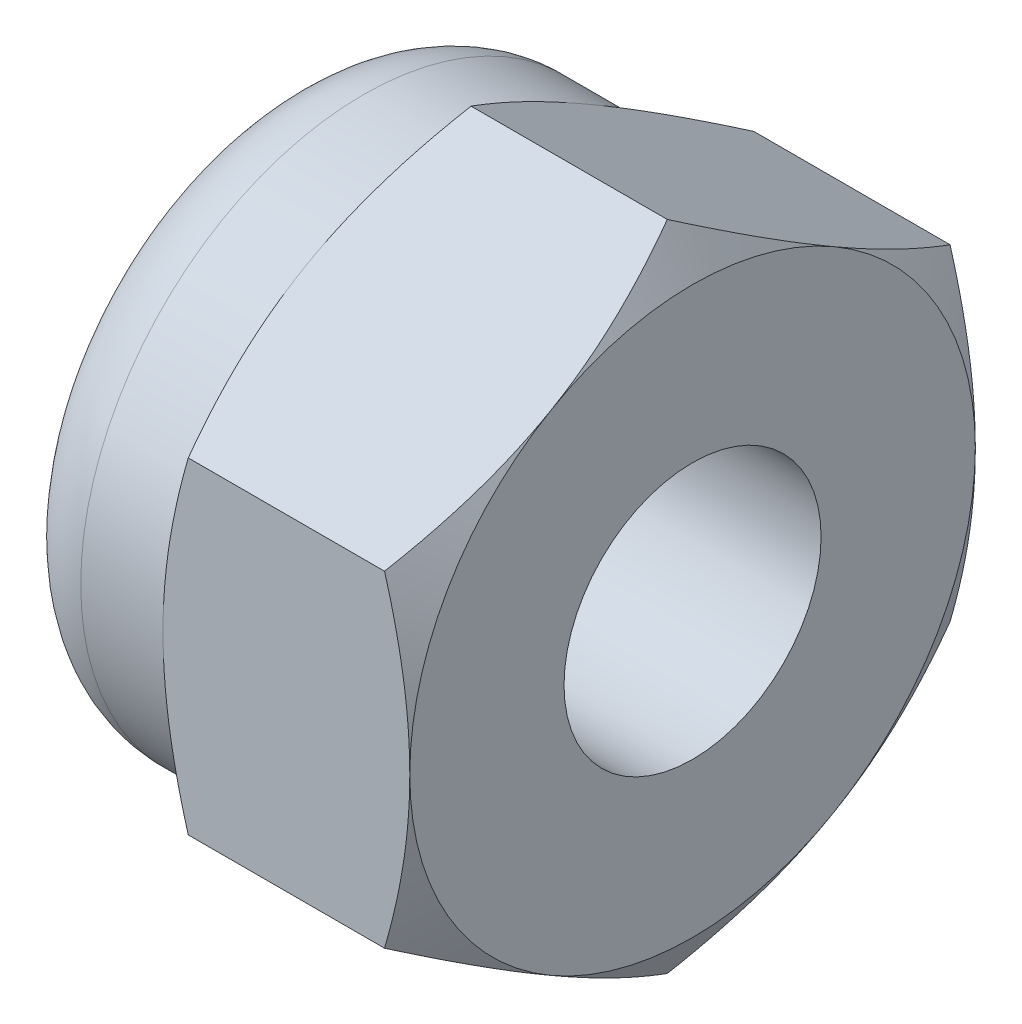
ISO-10303-21;
HEADER;
FILE_DESCRIPTION(('STEP AP214'),'2;1');
FILE_NAME('part.step','',(''),(''),'','','');
FILE_SCHEMA(('AUTOMOTIVE_DESIGN { 1 0 10303 214 1 1 1 1 }'));
ENDSEC;
DATA;
#1=APPLICATION_CONTEXT('core data for automotive mechanical design processes');
#2=APPLICATION_PROTOCOL_DEFINITION('international standard','automotive_design',2000,#1);
#3=PRODUCT_CONTEXT('',#1,'mechanical');
#4=PRODUCT('Part','Part','',(#3));
#5=PRODUCT_RELATED_PRODUCT_CATEGORY('part','',(#4));
#6=PRODUCT_DEFINITION_FORMATION('','',#4);
#7=PRODUCT_DEFINITION_CONTEXT('part definition',#1,'design');
#8=PRODUCT_DEFINITION('design','',#6,#7);
#9=PRODUCT_DEFINITION_SHAPE('','',#8);
#10=(LENGTH_UNIT() NAMED_UNIT(*) SI_UNIT(.MILLI.,.METRE.));
#11=(NAMED_UNIT(*) PLANE_ANGLE_UNIT() SI_UNIT($,.RADIAN.));
#12=(NAMED_UNIT(*) SI_UNIT($,.STERADIAN.) SOLID_ANGLE_UNIT());
#13=UNCERTAINTY_MEASURE_WITH_UNIT(LENGTH_MEASURE(1.E-05),#10,'distance_accuracy_value','');
#14=(GEOMETRIC_REPRESENTATION_CONTEXT(3) GLOBAL_UNCERTAINTY_ASSIGNED_CONTEXT((#13)) GLOBAL_UNIT_ASSIGNED_CONTEXT((#10,
#11,#12)) REPRESENTATION_CONTEXT('',''));
#15=CARTESIAN_POINT('',(0.,0.,0.));
#16=DIRECTION('',(0.,0.,1.));
#17=DIRECTION('',(1.,0.,0.));
#18=AXIS2_PLACEMENT_3D('',#15,#16,#17);
#19=CARTESIAN_POINT('',(-4.,1.58771324027147,-2.75));
#20=DIRECTION('',(0.,0.866025403784439,-0.5));
#21=DIRECTION('',(0.,0.5,0.866025403784439));
#22=AXIS2_PLACEMENT_3D('',#19,#20,#21);
#23=PLANE('',#22);
#24=DIRECTION('',(1.,0.,0.));
#25=VECTOR('',#24,1.);
#26=CARTESIAN_POINT('',(-4.,1.58771324027147,-2.75));
#27=LINE('',#26,#25);
#28=CARTESIAN_POINT('',(-2.15437990693814,1.58771324027148,-2.75));
#29=VERTEX_POINT('',#28);
#30=CARTESIAN_POINT('',(-0.245620093061859,1.58771324027148,-2.75));
#31=VERTEX_POINT('',#30);
#32=EDGE_CURVE('E163',#29,#31,#27,.T.);
#33=ORIENTED_EDGE('',*,*,#32,.F.);
#34=CARTESIAN_POINT('',(-2.15431323663524,1.58759777021764,-2.7502));
#35=CARTESIAN_POINT('',(-2.19461233775074,1.65737010029699,-2.62935077934009));
#36=CARTESIAN_POINT('',(-2.23126309740234,1.72774469983533,-2.50745839737736));
#37=CARTESIAN_POINT('',(-2.2952378170302,1.86971254687003,-2.26156287327211));
#38=CARTESIAN_POINT('',(-2.3225391443255,1.94130831721583,-2.13755536142614));
#39=CARTESIAN_POINT('',(-2.36503825470588,2.08361254889599,-1.89107720202405));
#40=CARTESIAN_POINT('',(-2.38051888137754,2.15429911309864,-1.76864448141258));
#41=CARTESIAN_POINT('',(-2.39900060263006,2.29600490065923,-1.52320285763108));
#42=CARTESIAN_POINT('',(-2.4020170005374,2.36702360884404,-1.40019484676709));
#43=CARTESIAN_POINT('',(-2.39574685457145,2.49972966594897,-1.17034121338921));
#44=CARTESIAN_POINT('',(-2.3879998457233,2.56143686540073,-1.06346120874598));
#45=CARTESIAN_POINT('',(-2.36344481893565,2.68444923614047,-0.85039753266525));
#46=CARTESIAN_POINT('',(-2.34662841034943,2.74575398185008,-0.74421459835111));
#47=CARTESIAN_POINT('',(-2.30458807765405,2.86902004703207,-0.530711510606816));
#48=CARTESIAN_POINT('',(-2.27918591931277,2.93096576264318,-0.423418383857144));
#49=CARTESIAN_POINT('',(-2.22153277416002,3.05393320806134,-0.210432520715948));
#50=CARTESIAN_POINT('',(-2.18929533670102,3.11495651365995,-0.104737054973347));
#51=CARTESIAN_POINT('',(-2.15431323663524,3.17554195059678,0.000200000000000793));
#52=B_SPLINE_CURVE_WITH_KNOTS('',3,(#34,#35,#36,#37,#38,#39,#40,#41,#42,#43,#44,#45,#46,#47,#48,
#49,#50,#51),.UNSPECIFIED.,.F.,.F.,(4,2,2,2,2,2,2,2,4),(0.,0.435912828725887,0.872873557116331,
1.29901931904671,1.72464171213573,2.09526089052937,2.46622354066374,2.84541551798557,
3.22386274754524),.UNSPECIFIED.);
#53=CARTESIAN_POINT('',(-2.4,2.38156986040721,-1.375));
#54=VERTEX_POINT('',#53);
#55=EDGE_CURVE('E283',#29,#54,#52,.T.);
#56=ORIENTED_EDGE('',*,*,#55,.T.);
#57=CARTESIAN_POINT('',(-2.15437990693814,3.17542648054294,0.));
#58=VERTEX_POINT('',#57);
#59=EDGE_CURVE('E277',#54,#58,#52,.T.);
#60=ORIENTED_EDGE('',*,*,#59,.T.);
#61=DIRECTION('',(1.,0.,0.));
#62=VECTOR('',#61,1.);
#63=CARTESIAN_POINT('',(-4.,3.17542648054294,0.));
#64=LINE('',#63,#62);
#65=CARTESIAN_POINT('',(-0.245620093061859,3.17542648054294,0.));
#66=VERTEX_POINT('',#65);
#67=EDGE_CURVE('E170',#58,#66,#64,.T.);
#68=ORIENTED_EDGE('',*,*,#67,.T.);
#69=CARTESIAN_POINT('',(-0.245686763364757,3.17554195059678,0.000200000000000732));
#70=CARTESIAN_POINT('',(-0.20538766224926,3.10576962051743,-0.120649220659905));
#71=CARTESIAN_POINT('',(-0.16873690259766,3.03539502097908,-0.242541602622633));
#72=CARTESIAN_POINT('',(-0.104762182969799,2.89342717394439,-0.488437126727892));
#73=CARTESIAN_POINT('',(-0.0774608556744962,2.82183140359859,-0.612444638573854));
#74=CARTESIAN_POINT('',(-0.0349617452941162,2.67952717191843,-0.858922797975942));
#75=CARTESIAN_POINT('',(-0.0194811186224573,2.60884060771577,-0.981355518587416));
#76=CARTESIAN_POINT('',(-0.000999397369939991,2.46713482015519,-1.22679714236891));
#77=CARTESIAN_POINT('',(0.00201700053740085,2.39611611197038,-1.34980515323291));
#78=CARTESIAN_POINT('',(-0.00425314542854591,2.26341005486544,-1.57965878661079));
#79=CARTESIAN_POINT('',(-0.0120001542767014,2.20170285541369,-1.68653879125402));
#80=CARTESIAN_POINT('',(-0.0365551810643533,2.07869048467395,-1.89960246733475));
#81=CARTESIAN_POINT('',(-0.0533715896505684,2.01738573896434,-2.00578540164889));
#82=CARTESIAN_POINT('',(-0.0954119223459535,1.89411967378235,-2.21928848939318));
#83=CARTESIAN_POINT('',(-0.120814080687228,1.83217395817123,-2.32658161614285));
#84=CARTESIAN_POINT('',(-0.178467225839978,1.70920651275308,-2.53956747928405));
#85=CARTESIAN_POINT('',(-0.210704663298978,1.64818320715446,-2.64526294502665));
#86=CARTESIAN_POINT('',(-0.245686763364755,1.58759777021764,-2.7502));
#87=B_SPLINE_CURVE_WITH_KNOTS('',3,(#69,#70,#71,#72,#73,#74,#75,#76,#77,#78,#79,#80,#81,#82,#83,
#84,#85,#86),.UNSPECIFIED.,.F.,.F.,(4,2,2,2,2,2,2,2,4),(0.,0.435912828725888,0.872873557116331,
1.29901931904671,1.72464171213573,2.09526089052937,2.46622354066374,2.84541551798557,
3.22386274754524),.UNSPECIFIED.);
#88=CARTESIAN_POINT('',(0.,2.38156986040721,-1.375));
#89=VERTEX_POINT('',#88);
#90=EDGE_CURVE('E328',#66,#89,#87,.T.);
#91=ORIENTED_EDGE('',*,*,#90,.T.);
#92=EDGE_CURVE('E231',#89,#31,#87,.T.);
#93=ORIENTED_EDGE('',*,*,#92,.T.);
#94=EDGE_LOOP('',(#33,#56,#60,#68,#91,#93));
#95=FACE_BOUND('',#94,.T.);
#96=ADVANCED_FACE('F35',(#95),#23,.T.);
#97=CARTESIAN_POINT('',(-4.,-1.58771324027147,-2.75));
#98=DIRECTION('',(0.,0.,-1.));
#99=DIRECTION('',(0.,1.,0.));
#100=AXIS2_PLACEMENT_3D('',#97,#98,#99);
#101=PLANE('',#100);
#102=DIRECTION('',(1.,0.,0.));
#103=VECTOR('',#102,1.);
#104=CARTESIAN_POINT('',(-4.,-1.58771324027147,-2.75));
#105=LINE('',#104,#103);
#106=CARTESIAN_POINT('',(-2.15437990693814,-1.58771324027147,-2.75));
#107=VERTEX_POINT('',#106);
#108=CARTESIAN_POINT('',(-0.245620093061859,-1.58771324027147,-2.75));
#109=VERTEX_POINT('',#108);
#110=EDGE_CURVE('E160',#107,#109,#105,.T.);
#111=ORIENTED_EDGE('',*,*,#110,.F.);
#112=CARTESIAN_POINT('',(-1.08405108591023,-4.21085047466774,-2.75));
#113=CARTESIAN_POINT('',(-1.14239960966293,-4.09010989011095,-2.75));
#114=CARTESIAN_POINT('',(-1.20016810098766,-3.96908383499853,-2.75));
#115=CARTESIAN_POINT('',(-1.31421356815426,-3.72630642982622,-2.75));
#116=CARTESIAN_POINT('',(-1.37049028575682,-3.60455495860072,-2.75));
#117=CARTESIAN_POINT('',(-1.48151722378069,-3.35951467553998,-2.75));
#118=CARTESIAN_POINT('',(-1.53625686571547,-3.23622105325521,-2.75));
#119=CARTESIAN_POINT('',(-1.6433849498491,-2.98862044341193,-2.75));
#120=CARTESIAN_POINT('',(-1.69577351460521,-2.86431350907558,-2.75));
#121=CARTESIAN_POINT('',(-1.79819621428788,-2.61294539628322,-2.75));
#122=CARTESIAN_POINT('',(-1.84819354800061,-2.48586914007059,-2.75));
#123=CARTESIAN_POINT('',(-1.94427243496487,-2.23021775204037,-2.75));
#124=CARTESIAN_POINT('',(-1.99035355255758,-2.1016424552668,-2.75));
#125=CARTESIAN_POINT('',(-2.07736182002804,-1.84305250936245,-2.75));
#126=CARTESIAN_POINT('',(-2.11829992722098,-1.71304158512251,-2.75));
#127=CARTESIAN_POINT('',(-2.19369263632952,-1.45117146066374,-2.75));
#128=CARTESIAN_POINT('',(-2.22814928856133,-1.31931285916158,-2.75));
#129=CARTESIAN_POINT('',(-2.28890631402182,-1.05365730058872,-2.75));
#130=CARTESIAN_POINT('',(-2.31520451432339,-0.91985983703522,-2.75));
#131=CARTESIAN_POINT('',(-2.35787397795958,-0.650651771588405,-2.75));
#132=CARTESIAN_POINT('',(-2.374245232524,-0.51524116827003,-2.75));
#133=CARTESIAN_POINT('',(-2.39561251963743,-0.244372959827892,-2.75));
#134=CARTESIAN_POINT('',(-2.40068056630442,-0.108921183336607,-2.75));
#135=CARTESIAN_POINT('',(-2.39917219036022,0.161887520872983,-2.75));
#136=CARTESIAN_POINT('',(-2.39259879041321,0.297244464085856,-2.75));
#137=CARTESIAN_POINT('',(-2.37189580522956,0.52838603312679,-2.75));
#138=CARTESIAN_POINT('',(-2.36046228070885,0.624425663637138,-2.75));
#139=CARTESIAN_POINT('',(-2.33247817430538,0.815763046773999,-2.75));
#140=CARTESIAN_POINT('',(-2.31592678540798,0.911060679966734,-2.75));
#141=CARTESIAN_POINT('',(-2.25946447516098,1.19576289915276,-2.75));
#142=CARTESIAN_POINT('',(-2.21275994778995,1.38383299011474,-2.75));
#143=CARTESIAN_POINT('',(-2.13220726693515,1.66525127863567,-2.75));
#144=CARTESIAN_POINT('',(-2.10319641445221,1.76006636738015,-2.75));
#145=CARTESIAN_POINT('',(-2.04230407192395,1.9487069300056,-2.75));
#146=CARTESIAN_POINT('',(-2.01042456185308,2.04253303727579,-2.75));
#147=CARTESIAN_POINT('',(-1.94445826089924,2.22880328617383,-2.75));
#148=CARTESIAN_POINT('',(-1.91038490408283,2.32125223383933,-2.75));
#149=CARTESIAN_POINT('',(-1.84023827062062,2.50543284907629,-2.75));
#150=CARTESIAN_POINT('',(-1.80416418567468,2.59716420940991,-2.75));
#151=CARTESIAN_POINT('',(-1.76728717077665,2.68856388993766,-2.75));
#152=B_SPLINE_CURVE_WITH_KNOTS('',3,(#112,#113,#114,#115,#116,#117,#118,#119,#120,#121,#122,
#123,#124,#125,#126,#127,#128,#129,#130,#131,#132,#133,#134,#135,#136,#137,#138,#139,#140,#141,
#142,#143,#144,#145,#146,#147,#148,#149,#150,#151),.UNSPECIFIED.,.F.,.F.,(4,2,2,2,2,2,2,2,2,2,2,
2,2,2,2,2,2,2,2,4),(0.,0.402305724628122,0.804680643080822,1.20935819137344,1.61401462001939,
2.02363897413607,2.43330883735974,2.8420905276564,3.25074268740349,3.6595035945605,
4.06826486284692,4.47441433252271,4.88045836225495,5.17047019471949,5.46052778127857,
6.04107464708557,6.33851326493238,6.63574813987144,6.93130997697814,7.22699210430481),.UNSPECIFIED.);
#153=CARTESIAN_POINT('',(-2.4,0.,-2.75));
#154=VERTEX_POINT('',#153);
#155=EDGE_CURVE('E153',#107,#154,#152,.T.);
#156=ORIENTED_EDGE('',*,*,#155,.T.);
#157=EDGE_CURVE('E246',#154,#29,#152,.T.);
#158=ORIENTED_EDGE('',*,*,#157,.T.);
#159=ORIENTED_EDGE('',*,*,#32,.T.);
#160=CARTESIAN_POINT('',(-1.31594891408976,-4.21085047466774,-2.75));
#161=CARTESIAN_POINT('',(-1.25760039033706,-4.09010989011094,-2.75));
#162=CARTESIAN_POINT('',(-1.19983189901234,-3.96908383499853,-2.75));
#163=CARTESIAN_POINT('',(-1.08578643184574,-3.72630642982622,-2.75));
#164=CARTESIAN_POINT('',(-1.02950971424317,-3.60455495860072,-2.75));
#165=CARTESIAN_POINT('',(-0.918482776219309,-3.35951467553998,-2.75));
#166=CARTESIAN_POINT('',(-0.863743134284527,-3.23622105325521,-2.75));
#167=CARTESIAN_POINT('',(-0.756615050150899,-2.98862044341193,-2.75));
#168=CARTESIAN_POINT('',(-0.704226485394788,-2.86431350907558,-2.75));
#169=CARTESIAN_POINT('',(-0.601803785712118,-2.61294539628323,-2.75));
#170=CARTESIAN_POINT('',(-0.551806451999385,-2.48586914007059,-2.75));
#171=CARTESIAN_POINT('',(-0.455727565035127,-2.23021775204037,-2.75));
#172=CARTESIAN_POINT('',(-0.409646447442418,-2.1016424552668,-2.75));
#173=CARTESIAN_POINT('',(-0.322638179971965,-1.84305250936246,-2.75));
#174=CARTESIAN_POINT('',(-0.281700072779021,-1.71304158512251,-2.75));
#175=CARTESIAN_POINT('',(-0.206307363670478,-1.45117146066374,-2.75));
#176=CARTESIAN_POINT('',(-0.171850711438669,-1.31931285916158,-2.75));
#177=CARTESIAN_POINT('',(-0.11109368597818,-1.05365730058872,-2.75));
#178=CARTESIAN_POINT('',(-0.0847954856766139,-0.919859837035221,-2.75));
#179=CARTESIAN_POINT('',(-0.0421260220404217,-0.650651771588406,-2.75));
#180=CARTESIAN_POINT('',(-0.0257547674760019,-0.515241168270031,-2.75));
#181=CARTESIAN_POINT('',(-0.00438748036256584,-0.244372959827892,-2.75));
#182=CARTESIAN_POINT('',(0.000680566304424056,-0.108921183336607,-2.75));
#183=CARTESIAN_POINT('',(-0.000827809639778918,0.161887520872983,-2.75));
#184=CARTESIAN_POINT('',(-0.00740120958678832,0.297244464085855,-2.75));
#185=CARTESIAN_POINT('',(-0.0281041947704376,0.528386033126789,-2.75));
#186=CARTESIAN_POINT('',(-0.0395377192911538,0.624425663637137,-2.75));
#187=CARTESIAN_POINT('',(-0.0675218256946247,0.815763046773998,-2.75));
#188=CARTESIAN_POINT('',(-0.0840732145920173,0.911060679966735,-2.75));
#189=CARTESIAN_POINT('',(-0.140535524839016,1.19576289915276,-2.75));
#190=CARTESIAN_POINT('',(-0.187240052210045,1.38383299011475,-2.75));
#191=CARTESIAN_POINT('',(-0.267792733064847,1.66525127863567,-2.75));
#192=CARTESIAN_POINT('',(-0.29680358554779,1.76006636738016,-2.75));
#193=CARTESIAN_POINT('',(-0.357695928076048,1.94870693000561,-2.75));
#194=CARTESIAN_POINT('',(-0.389575438146922,2.04253303727579,-2.75));
#195=CARTESIAN_POINT('',(-0.455541739100759,2.22880328617383,-2.75));
#196=CARTESIAN_POINT('',(-0.489615095917171,2.32125223383934,-2.75));
#197=CARTESIAN_POINT('',(-0.559761729379377,2.5054328490763,-2.75));
#198=CARTESIAN_POINT('',(-0.595835814325318,2.59716420940992,-2.75));
#199=CARTESIAN_POINT('',(-0.632712829223347,2.68856388993767,-2.75));
#200=B_SPLINE_CURVE_WITH_KNOTS('',3,(#160,#161,#162,#163,#164,#165,#166,#167,#168,#169,#170,
#171,#172,#173,#174,#175,#176,#177,#178,#179,#180,#181,#182,#183,#184,#185,#186,#187,#188,#189,
#190,#191,#192,#193,#194,#195,#196,#197,#198,#199),.UNSPECIFIED.,.F.,.F.,(4,2,2,2,2,2,2,2,2,2,2,
2,2,2,2,2,2,2,2,4),(0.,0.402305724628121,0.80468064308082,1.20935819137344,1.61401462001939,
2.02363897413607,2.43330883735973,2.84209052765639,3.25074268740349,3.65950359456049,
4.06826486284691,4.47441433252271,4.88045836225495,5.17047019471949,5.46052778127857,
6.04107464708557,6.33851326493238,6.63574813987144,6.93130997697814,7.22699210430481),.UNSPECIFIED.);
#201=CARTESIAN_POINT('',(0.,0.,-2.75));
#202=VERTEX_POINT('',#201);
#203=EDGE_CURVE('E229',#31,#202,#200,.F.);
#204=ORIENTED_EDGE('',*,*,#203,.T.);
#205=EDGE_CURVE('E222',#202,#109,#200,.F.);
#206=ORIENTED_EDGE('',*,*,#205,.T.);
#207=EDGE_LOOP('',(#111,#156,#158,#159,#204,#206));
#208=FACE_BOUND('',#207,.T.);
#209=ADVANCED_FACE('F237',(#208),#101,.T.);
#210=CARTESIAN_POINT('',(-4.,-3.17542648054294,0.));
#211=DIRECTION('',(0.,-0.866025403784439,-0.5));
#212=DIRECTION('',(0.,0.5,-0.866025403784439));
#213=AXIS2_PLACEMENT_3D('',#210,#211,#212);
#214=PLANE('',#213);
#215=DIRECTION('',(1.,0.,0.));
#216=VECTOR('',#215,1.);
#217=CARTESIAN_POINT('',(-4.,-3.17542648054294,0.));
#218=LINE('',#217,#216);
#219=CARTESIAN_POINT('',(-2.15437990693814,-3.17542648054294,0.));
#220=VERTEX_POINT('',#219);
#221=CARTESIAN_POINT('',(-0.245620093061859,-3.17542648054294,0.));
#222=VERTEX_POINT('',#221);
#223=EDGE_CURVE('E150',#220,#222,#218,.T.);
#224=ORIENTED_EDGE('',*,*,#223,.F.);
#225=CARTESIAN_POINT('',(-2.15431323663524,-3.17554195059678,0.00020000000000105));
#226=CARTESIAN_POINT('',(-2.19461233775074,-3.10576962051743,-0.120649220659905));
#227=CARTESIAN_POINT('',(-2.23126309740234,-3.03539502097908,-0.242541602622633));
#228=CARTESIAN_POINT('',(-2.2952378170302,-2.89342717394439,-0.488437126727891));
#229=CARTESIAN_POINT('',(-2.3225391443255,-2.82183140359858,-0.612444638573854));
#230=CARTESIAN_POINT('',(-2.36503825470588,-2.67952717191843,-0.858922797975942));
#231=CARTESIAN_POINT('',(-2.38051888137754,-2.60884060771577,-0.981355518587416));
#232=CARTESIAN_POINT('',(-2.39900060263006,-2.46713482015519,-1.22679714236891));
#233=CARTESIAN_POINT('',(-2.4020170005374,-2.39611611197038,-1.34980515323291));
#234=CARTESIAN_POINT('',(-2.39574685457145,-2.26341005486544,-1.57965878661079));
#235=CARTESIAN_POINT('',(-2.3879998457233,-2.20170285541369,-1.68653879125402));
#236=CARTESIAN_POINT('',(-2.36344481893565,-2.07869048467395,-1.89960246733475));
#237=CARTESIAN_POINT('',(-2.34662841034943,-2.01738573896434,-2.00578540164889));
#238=CARTESIAN_POINT('',(-2.30458807765405,-1.89411967378235,-2.21928848939318));
#239=CARTESIAN_POINT('',(-2.27918591931277,-1.83217395817123,-2.32658161614285));
#240=CARTESIAN_POINT('',(-2.22153277416002,-1.70920651275308,-2.53956747928405));
#241=CARTESIAN_POINT('',(-2.18929533670102,-1.64818320715446,-2.64526294502665));
#242=CARTESIAN_POINT('',(-2.15431323663524,-1.58759777021764,-2.7502));
#243=B_SPLINE_CURVE_WITH_KNOTS('',3,(#225,#226,#227,#228,#229,#230,#231,#232,#233,#234,#235,
#236,#237,#238,#239,#240,#241,#242),.UNSPECIFIED.,.F.,.F.,(4,2,2,2,2,2,2,2,4),(0.,
0.435912828725888,0.872873557116331,1.29901931904671,1.72464171213573,2.09526089052937,
2.46622354066374,2.84541551798557,3.22386274754524),.UNSPECIFIED.);
#244=CARTESIAN_POINT('',(-2.4,-2.38156986040721,-1.375));
#245=VERTEX_POINT('',#244);
#246=EDGE_CURVE('E132',#220,#245,#243,.T.);
#247=ORIENTED_EDGE('',*,*,#246,.T.);
#248=EDGE_CURVE('E143',#245,#107,#243,.T.);
#249=ORIENTED_EDGE('',*,*,#248,.T.);
#250=ORIENTED_EDGE('',*,*,#110,.T.);
#251=CARTESIAN_POINT('',(-0.245686763364755,-1.58759777021764,-2.7502));
#252=CARTESIAN_POINT('',(-0.205387662249259,-1.65737010029699,-2.62935077934009));
#253=CARTESIAN_POINT('',(-0.168736902597658,-1.72774469983533,-2.50745839737736));
#254=CARTESIAN_POINT('',(-0.104762182969798,-1.86971254687003,-2.26156287327211));
#255=CARTESIAN_POINT('',(-0.0774608556744953,-1.94130831721583,-2.13755536142614));
#256=CARTESIAN_POINT('',(-0.0349617452941155,-2.08361254889599,-1.89107720202405));
#257=CARTESIAN_POINT('',(-0.0194811186224567,-2.15429911309864,-1.76864448141258));
#258=CARTESIAN_POINT('',(-0.000999397369939655,-2.29600490065923,-1.52320285763108));
#259=CARTESIAN_POINT('',(0.00201700053740091,-2.36702360884404,-1.40019484676709));
#260=CARTESIAN_POINT('',(-0.00425314542854593,-2.49972966594897,-1.17034121338921));
#261=CARTESIAN_POINT('',(-0.0120001542767013,-2.56143686540073,-1.06346120874598));
#262=CARTESIAN_POINT('',(-0.0365551810643533,-2.68444923614047,-0.85039753266525));
#263=CARTESIAN_POINT('',(-0.0533715896505686,-2.74575398185008,-0.74421459835111));
#264=CARTESIAN_POINT('',(-0.0954119223459542,-2.86902004703206,-0.530711510606815));
#265=CARTESIAN_POINT('',(-0.120814080687228,-2.93096576264318,-0.423418383857144));
#266=CARTESIAN_POINT('',(-0.178467225839979,-3.05393320806134,-0.210432520715948));
#267=CARTESIAN_POINT('',(-0.210704663298979,-3.11495651365995,-0.104737054973346));
#268=CARTESIAN_POINT('',(-0.245686763364756,-3.17554195059678,0.000200000000000986));
#269=B_SPLINE_CURVE_WITH_KNOTS('',3,(#251,#252,#253,#254,#255,#256,#257,#258,#259,#260,#261,
#262,#263,#264,#265,#266,#267,#268),.UNSPECIFIED.,.F.,.F.,(4,2,2,2,2,2,2,2,4),(0.,
0.435912828725888,0.872873557116331,1.29901931904671,1.72464171213573,2.09526089052937,
2.46622354066374,2.84541551798557,3.22386274754524),.UNSPECIFIED.);
#270=CARTESIAN_POINT('',(0.,-2.38156986040721,-1.375));
#271=VERTEX_POINT('',#270);
#272=EDGE_CURVE('E230',#109,#271,#269,.T.);
#273=ORIENTED_EDGE('',*,*,#272,.T.);
#274=EDGE_CURVE('E159',#271,#222,#269,.T.);
#275=ORIENTED_EDGE('',*,*,#274,.T.);
#276=EDGE_LOOP('',(#224,#247,#249,#250,#273,#275));
#277=FACE_BOUND('',#276,.T.);
#278=ADVANCED_FACE('F156',(#277),#214,.T.);
#279=CARTESIAN_POINT('',(-4.,-1.58771324027147,2.75));
#280=DIRECTION('',(0.,-0.866025403784439,0.5));
#281=DIRECTION('',(0.,-0.5,-0.866025403784439));
#282=AXIS2_PLACEMENT_3D('',#279,#280,#281);
#283=PLANE('',#282);
#284=DIRECTION('',(1.,0.,0.));
#285=VECTOR('',#284,1.);
#286=CARTESIAN_POINT('',(-4.,-1.58771324027147,2.75));
#287=LINE('',#286,#285);
#288=CARTESIAN_POINT('',(-2.15437990693814,-1.58771324027147,2.75));
#289=VERTEX_POINT('',#288);
#290=CARTESIAN_POINT('',(-0.245620093061859,-1.58771324027147,2.75));
#291=VERTEX_POINT('',#290);
#292=EDGE_CURVE('E161',#289,#291,#287,.T.);
#293=ORIENTED_EDGE('',*,*,#292,.F.);
#294=CARTESIAN_POINT('',(-2.15431323663524,-1.58759777021763,2.7502));
#295=CARTESIAN_POINT('',(-2.19461233775074,-1.65737010029699,2.6293507793401));
#296=CARTESIAN_POINT('',(-2.23126309740234,-1.72774469983533,2.50745839737737));
#297=CARTESIAN_POINT('',(-2.2952378170302,-1.86971254687003,2.26156287327211));
#298=CARTESIAN_POINT('',(-2.3225391443255,-1.94130831721583,2.13755536142615));
#299=CARTESIAN_POINT('',(-2.36503825470588,-2.08361254889599,1.89107720202406));
#300=CARTESIAN_POINT('',(-2.38051888137754,-2.15429911309864,1.76864448141258));
#301=CARTESIAN_POINT('',(-2.39900060263006,-2.29600490065923,1.52320285763109));
#302=CARTESIAN_POINT('',(-2.4020170005374,-2.36702360884404,1.40019484676709));
#303=CARTESIAN_POINT('',(-2.39574685457145,-2.49972966594897,1.17034121338921));
#304=CARTESIAN_POINT('',(-2.3879998457233,-2.56143686540073,1.06346120874598));
#305=CARTESIAN_POINT('',(-2.36344481893565,-2.68444923614047,0.850397532665252));
#306=CARTESIAN_POINT('',(-2.34662841034943,-2.74575398185008,0.744214598351112));
#307=CARTESIAN_POINT('',(-2.30458807765405,-2.86902004703206,0.530711510606818));
#308=CARTESIAN_POINT('',(-2.27918591931277,-2.93096576264318,0.423418383857146));
#309=CARTESIAN_POINT('',(-2.22153277416002,-3.05393320806134,0.21043252071595));
#310=CARTESIAN_POINT('',(-2.18929533670102,-3.11495651365995,0.104737054973348));
#311=CARTESIAN_POINT('',(-2.15431323663524,-3.17554195059678,-0.000199999999999301));
#312=B_SPLINE_CURVE_WITH_KNOTS('',3,(#294,#295,#296,#297,#298,#299,#300,#301,#302,#303,#304,
#305,#306,#307,#308,#309,#310,#311),.UNSPECIFIED.,.F.,.F.,(4,2,2,2,2,2,2,2,4),(0.,
0.435912828725888,0.872873557116331,1.29901931904671,1.72464171213573,2.09526089052937,
2.46622354066374,2.84541551798557,3.22386274754524),.UNSPECIFIED.);
#313=CARTESIAN_POINT('',(-2.4,-2.38156986040721,1.375));
#314=VERTEX_POINT('',#313);
#315=EDGE_CURVE('E152',#289,#314,#312,.T.);
#316=ORIENTED_EDGE('',*,*,#315,.T.);
#317=EDGE_CURVE('E135',#314,#220,#312,.T.);
#318=ORIENTED_EDGE('',*,*,#317,.T.);
#319=ORIENTED_EDGE('',*,*,#223,.T.);
#320=CARTESIAN_POINT('',(-0.245686763364756,-3.17554195059678,-0.000199999999998929));
#321=CARTESIAN_POINT('',(-0.205387662249259,-3.10576962051743,0.120649220659907));
#322=CARTESIAN_POINT('',(-0.168736902597659,-3.03539502097908,0.242541602622635));
#323=CARTESIAN_POINT('',(-0.104762182969798,-2.89342717394439,0.488437126727893));
#324=CARTESIAN_POINT('',(-0.0774608556744954,-2.82183140359858,0.612444638573856));
#325=CARTESIAN_POINT('',(-0.0349617452941156,-2.67952717191843,0.858922797975944));
#326=CARTESIAN_POINT('',(-0.0194811186224569,-2.60884060771577,0.981355518587417));
#327=CARTESIAN_POINT('',(-0.000999397369939867,-2.46713482015519,1.22679714236892));
#328=CARTESIAN_POINT('',(0.0020170005374009,-2.39611611197038,1.34980515323291));
#329=CARTESIAN_POINT('',(-0.00425314542854602,-2.26341005486544,1.57965878661079));
#330=CARTESIAN_POINT('',(-0.0120001542767017,-2.20170285541369,1.68653879125402));
#331=CARTESIAN_POINT('',(-0.0365551810643537,-2.07869048467395,1.89960246733475));
#332=CARTESIAN_POINT('',(-0.0533715896505689,-2.01738573896433,2.00578540164889));
#333=CARTESIAN_POINT('',(-0.0954119223459542,-1.89411967378235,2.21928848939318));
#334=CARTESIAN_POINT('',(-0.120814080687228,-1.83217395817123,2.32658161614286));
#335=CARTESIAN_POINT('',(-0.178467225839979,-1.70920651275308,2.53956747928405));
#336=CARTESIAN_POINT('',(-0.210704663298979,-1.64818320715446,2.64526294502665));
#337=CARTESIAN_POINT('',(-0.245686763364757,-1.58759777021763,2.7502));
#338=B_SPLINE_CURVE_WITH_KNOTS('',3,(#320,#321,#322,#323,#324,#325,#326,#327,#328,#329,#330,
#331,#332,#333,#334,#335,#336,#337),.UNSPECIFIED.,.F.,.F.,(4,2,2,2,2,2,2,2,4),(0.,
0.435912828725888,0.87287355711633,1.29901931904671,1.72464171213573,2.09526089052937,
2.46622354066374,2.84541551798557,3.22386274754524),.UNSPECIFIED.);
#339=CARTESIAN_POINT('',(0.,-2.38156986040721,1.375));
#340=VERTEX_POINT('',#339);
#341=EDGE_CURVE('E301',#222,#340,#338,.T.);
#342=ORIENTED_EDGE('',*,*,#341,.T.);
#343=EDGE_CURVE('E209',#340,#291,#338,.T.);
#344=ORIENTED_EDGE('',*,*,#343,.T.);
#345=EDGE_LOOP('',(#293,#316,#318,#319,#342,#344));
#346=FACE_BOUND('',#345,.T.);
#347=ADVANCED_FACE('F148',(#346),#283,.T.);
#348=CARTESIAN_POINT('',(-4.,1.58771324027147,2.75));
#349=DIRECTION('',(0.,0.,1.));
#350=DIRECTION('',(1.,0.,0.));
#351=AXIS2_PLACEMENT_3D('',#348,#349,#350);
#352=PLANE('',#351);
#353=DIRECTION('',(1.,0.,0.));
#354=VECTOR('',#353,1.);
#355=CARTESIAN_POINT('',(-4.,1.58771324027147,2.75));
#356=LINE('',#355,#354);
#357=CARTESIAN_POINT('',(-2.15437990693814,1.58771324027147,2.75));
#358=VERTEX_POINT('',#357);
#359=CARTESIAN_POINT('',(-0.245620093061859,1.58771324027147,2.75));
#360=VERTEX_POINT('',#359);
#361=EDGE_CURVE('E165',#358,#360,#356,.T.);
#362=ORIENTED_EDGE('',*,*,#361,.F.);
#363=CARTESIAN_POINT('',(-1.08405156039708,-4.21084949309676,2.75));
#364=CARTESIAN_POINT('',(-1.14240006384778,-4.0901089421409,2.75));
#365=CARTESIAN_POINT('',(-1.20016853488243,-3.96908292065509,2.75));
#366=CARTESIAN_POINT('',(-1.31421396157697,-3.72630558284843,2.75));
#367=CARTESIAN_POINT('',(-1.37049065899754,-3.604554145362,2.75));
#368=CARTESIAN_POINT('',(-1.48151755664726,-3.35951393034354,2.75));
#369=CARTESIAN_POINT('',(-1.53625717839418,-3.23622034236436,2.75));
#370=CARTESIAN_POINT('',(-1.64338522252356,-2.98861980138743,2.75));
#371=CARTESIAN_POINT('',(-1.69577376746325,-2.86431290161182,2.75));
#372=CARTESIAN_POINT('',(-1.79819642785389,-2.61294485887172,2.75));
#373=CARTESIAN_POINT('',(-1.84819374210162,-2.48586863815654,2.75));
#374=CARTESIAN_POINT('',(-1.94427259121541,-2.23021732171541,2.75));
#375=CARTESIAN_POINT('',(-1.99035369042304,-2.10164206103363,2.75));
#376=CARTESIAN_POINT('',(-2.07736192295377,-1.84305218799467,2.75));
#377=CARTESIAN_POINT('',(-2.11830001358612,-1.71304130052583,2.75));
#378=CARTESIAN_POINT('',(-2.19369269237566,-1.45117125062147,2.75));
#379=CARTESIAN_POINT('',(-2.22814933084724,-1.31931268690202,2.75));
#380=CARTESIAN_POINT('',(-2.2889063284691,-1.05365722480012,2.75));
#381=CARTESIAN_POINT('',(-2.31520451590488,-0.91985982021759,2.75));
#382=CARTESIAN_POINT('',(-2.35787396280339,-0.65065187403738,2.75));
#383=CARTESIAN_POINT('',(-2.37424521348946,-0.515241331013594,2.75));
#384=CARTESIAN_POINT('',(-2.39561250345976,-0.24437324286921,2.75));
#385=CARTESIAN_POINT('',(-2.40068055677322,-0.108921526377133,2.75));
#386=CARTESIAN_POINT('',(-2.39917220436733,0.161887058855134,2.75));
#387=CARTESIAN_POINT('',(-2.39259882131445,0.29724394308964,2.75));
#388=CARTESIAN_POINT('',(-2.37189586995316,0.528385436717544,2.75));
#389=CARTESIAN_POINT('',(-2.36046235896981,0.624425050137504,2.75));
#390=CARTESIAN_POINT('',(-2.33247828038665,0.81576239981155,2.75));
#391=CARTESIAN_POINT('',(-2.31592690577232,0.911060016631974,2.75));
#392=CARTESIAN_POINT('',(-2.25946463872172,1.19576218748918,2.75));
#393=CARTESIAN_POINT('',(-2.2127601405827,1.38383224738498,2.75));
#394=CARTESIAN_POINT('',(-2.13220750296942,1.66525048947487,2.75));
#395=CARTESIAN_POINT('',(-2.1031966650045,1.7600655624856,2.75));
#396=CARTESIAN_POINT('',(-2.04230435109341,1.94870609382218,2.75));
#397=CARTESIAN_POINT('',(-2.01042485512149,2.04253218553699,2.75));
#398=CARTESIAN_POINT('',(-1.94445858181355,2.22880240354988,2.75));
#399=CARTESIAN_POINT('',(-1.91038523854446,2.32125133588455,2.75));
#400=CARTESIAN_POINT('',(-1.84023863176889,2.50543192042632,2.75));
#401=CARTESIAN_POINT('',(-1.80416455996268,2.59716326539583,2.75));
#402=CARTESIAN_POINT('',(-1.76728755800251,2.6885629305335,2.75));
#403=B_SPLINE_CURVE_WITH_KNOTS('',3,(#363,#364,#365,#366,#367,#368,#369,#370,#371,#372,#373,
#374,#375,#376,#377,#378,#379,#380,#381,#382,#383,#384,#385,#386,#387,#388,#389,#390,#391,#392,
#393,#394,#395,#396,#397,#398,#399,#400,#401,#402),.UNSPECIFIED.,.F.,.F.,(4,2,2,2,2,2,2,2,2,2,2,
2,2,2,2,2,2,2,2,4),(0.,0.402305607365936,0.804680408536995,1.20935783819118,1.61401414820818,
2.02363838185769,2.43330812457348,2.842089694796,3.25074173456636,3.65950246109143,
4.06826354901183,4.47441284024649,4.88045669141171,5.17046846817546,5.46052599902452,
6.04107275309884,6.33851131304663,6.63574613017457,6.93130791005795,7.22698998004826),.UNSPECIFIED.);
#404=CARTESIAN_POINT('',(-2.4,0.,2.75));
#405=VERTEX_POINT('',#404);
#406=EDGE_CURVE('E55',#358,#405,#403,.F.);
#407=ORIENTED_EDGE('',*,*,#406,.T.);
#408=EDGE_CURVE('E287',#405,#289,#403,.F.);
#409=ORIENTED_EDGE('',*,*,#408,.T.);
#410=ORIENTED_EDGE('',*,*,#292,.T.);
#411=CARTESIAN_POINT('',(-1.31594843960292,-4.21084949309676,2.75));
#412=CARTESIAN_POINT('',(-1.25759993615222,-4.0901089421409,2.75));
#413=CARTESIAN_POINT('',(-1.19983146511756,-3.96908292065509,2.75));
#414=CARTESIAN_POINT('',(-1.08578603842303,-3.72630558284843,2.75));
#415=CARTESIAN_POINT('',(-1.02950934100245,-3.604554145362,2.75));
#416=CARTESIAN_POINT('',(-0.91848244335274,-3.35951393034354,2.75));
#417=CARTESIAN_POINT('',(-0.863742821605821,-3.23622034236436,2.75));
#418=CARTESIAN_POINT('',(-0.756614777476439,-2.98861980138743,2.75));
#419=CARTESIAN_POINT('',(-0.704226232536749,-2.86431290161181,2.75));
#420=CARTESIAN_POINT('',(-0.601803572146111,-2.61294485887171,2.75));
#421=CARTESIAN_POINT('',(-0.551806257898382,-2.48586863815654,2.75));
#422=CARTESIAN_POINT('',(-0.455727408784591,-2.2302173217154,2.75));
#423=CARTESIAN_POINT('',(-0.409646309576962,-2.10164206103363,2.75));
#424=CARTESIAN_POINT('',(-0.322638077046224,-1.84305218799467,2.75));
#425=CARTESIAN_POINT('',(-0.281699986413882,-1.71304130052583,2.75));
#426=CARTESIAN_POINT('',(-0.206307307624343,-1.45117125062147,2.75));
#427=CARTESIAN_POINT('',(-0.171850669152763,-1.31931268690202,2.75));
#428=CARTESIAN_POINT('',(-0.111093671530901,-1.05365722480012,2.75));
#429=CARTESIAN_POINT('',(-0.0847954840951194,-0.919859820217589,2.75));
#430=CARTESIAN_POINT('',(-0.0421260371966101,-0.650651874037379,2.75));
#431=CARTESIAN_POINT('',(-0.0257547865105422,-0.515241331013593,2.75));
#432=CARTESIAN_POINT('',(-0.00438749654023714,-0.24437324286921,2.75));
#433=CARTESIAN_POINT('',(0.000680556773216019,-0.108921526377133,2.75));
#434=CARTESIAN_POINT('',(-0.000827795632672008,0.161887058855134,2.75));
#435=CARTESIAN_POINT('',(-0.00740117868555357,0.29724394308964,2.75));
#436=CARTESIAN_POINT('',(-0.0281041300468433,0.528385436717543,2.75));
#437=CARTESIAN_POINT('',(-0.0395376410301877,0.624425050137504,2.75));
#438=CARTESIAN_POINT('',(-0.0675217196133507,0.815762399811551,2.75));
#439=CARTESIAN_POINT('',(-0.0840730942276823,0.911060016631976,2.75));
#440=CARTESIAN_POINT('',(-0.140535361278285,1.19576218748918,2.75));
#441=CARTESIAN_POINT('',(-0.187239859417296,1.38383224738499,2.75));
#442=CARTESIAN_POINT('',(-0.267792497030582,1.66525048947488,2.75));
#443=CARTESIAN_POINT('',(-0.296803334995505,1.76006556248561,2.75));
#444=CARTESIAN_POINT('',(-0.357695648906593,1.94870609382219,2.75));
#445=CARTESIAN_POINT('',(-0.389575144878509,2.04253218553699,2.75));
#446=CARTESIAN_POINT('',(-0.455541418186455,2.22880240354989,2.75));
#447=CARTESIAN_POINT('',(-0.489614761455539,2.32125133588456,2.75));
#448=CARTESIAN_POINT('',(-0.559761368231117,2.50543192042633,2.75));
#449=CARTESIAN_POINT('',(-0.595835440037326,2.59716326539584,2.75));
#450=CARTESIAN_POINT('',(-0.632712441997493,2.68856293053351,2.75));
#451=B_SPLINE_CURVE_WITH_KNOTS('',3,(#411,#412,#413,#414,#415,#416,#417,#418,#419,#420,#421,
#422,#423,#424,#425,#426,#427,#428,#429,#430,#431,#432,#433,#434,#435,#436,#437,#438,#439,#440,
#441,#442,#443,#444,#445,#446,#447,#448,#449,#450),.UNSPECIFIED.,.F.,.F.,(4,2,2,2,2,2,2,2,2,2,2,
2,2,2,2,2,2,2,2,4),(0.,0.402305607365936,0.804680408536996,1.20935783819118,1.61401414820818,
2.0236383818577,2.43330812457348,2.842089694796,3.25074173456636,3.65950246109143,
4.06826354901183,4.47441284024649,4.88045669141171,5.17046846817545,5.46052599902452,
6.04107275309885,6.33851131304664,6.63574613017458,6.93130791005796,7.22698998004827),.UNSPECIFIED.);
#452=CARTESIAN_POINT('',(0.,0.,2.75));
#453=VERTEX_POINT('',#452);
#454=EDGE_CURVE('E304',#291,#453,#451,.T.);
#455=ORIENTED_EDGE('',*,*,#454,.T.);
#456=EDGE_CURVE('E201',#453,#360,#451,.T.);
#457=ORIENTED_EDGE('',*,*,#456,.T.);
#458=EDGE_LOOP('',(#362,#407,#409,#410,#455,#457));
#459=FACE_BOUND('',#458,.T.);
#460=ADVANCED_FACE('F294',(#459),#352,.T.);
#461=CARTESIAN_POINT('',(-4.,3.17542648054294,0.));
#462=DIRECTION('',(0.,0.866025403784439,0.5));
#463=DIRECTION('',(0.,-0.5,0.866025403784439));
#464=AXIS2_PLACEMENT_3D('',#461,#462,#463);
#465=PLANE('',#464);
#466=ORIENTED_EDGE('',*,*,#67,.F.);
#467=CARTESIAN_POINT('',(-2.15431323663524,3.17554195059678,-0.000199999999999192));
#468=CARTESIAN_POINT('',(-2.19461233775074,3.10576962051743,0.120649220659907));
#469=CARTESIAN_POINT('',(-2.23126309740234,3.03539502097908,0.242541602622635));
#470=CARTESIAN_POINT('',(-2.2952378170302,2.89342717394439,0.488437126727893));
#471=CARTESIAN_POINT('',(-2.3225391443255,2.82183140359858,0.612444638573856));
#472=CARTESIAN_POINT('',(-2.36503825470588,2.67952717191843,0.858922797975944));
#473=CARTESIAN_POINT('',(-2.38051888137754,2.60884060771577,0.981355518587418));
#474=CARTESIAN_POINT('',(-2.39900060263006,2.46713482015519,1.22679714236892));
#475=CARTESIAN_POINT('',(-2.4020170005374,2.39611611197038,1.34980515323291));
#476=CARTESIAN_POINT('',(-2.39574685457145,2.26341005486544,1.57965878661079));
#477=CARTESIAN_POINT('',(-2.3879998457233,2.20170285541369,1.68653879125402));
#478=CARTESIAN_POINT('',(-2.36344481893565,2.07869048467395,1.89960246733475));
#479=CARTESIAN_POINT('',(-2.34662841034943,2.01738573896434,2.00578540164889));
#480=CARTESIAN_POINT('',(-2.30458807765405,1.89411967378235,2.21928848939318));
#481=CARTESIAN_POINT('',(-2.27918591931277,1.83217395817123,2.32658161614286));
#482=CARTESIAN_POINT('',(-2.22153277416002,1.70920651275308,2.53956747928405));
#483=CARTESIAN_POINT('',(-2.18929533670102,1.64818320715446,2.64526294502665));
#484=CARTESIAN_POINT('',(-2.15431323663524,1.58759777021763,2.7502));
#485=B_SPLINE_CURVE_WITH_KNOTS('',3,(#467,#468,#469,#470,#471,#472,#473,#474,#475,#476,#477,
#478,#479,#480,#481,#482,#483,#484),.UNSPECIFIED.,.F.,.F.,(4,2,2,2,2,2,2,2,4),(0.,
0.435912828725888,0.872873557116331,1.29901931904671,1.72464171213573,2.09526089052937,
2.46622354066374,2.84541551798557,3.22386274754524),.UNSPECIFIED.);
#486=CARTESIAN_POINT('',(-2.4,2.38156986040721,1.375));
#487=VERTEX_POINT('',#486);
#488=EDGE_CURVE('E11',#58,#487,#485,.T.);
#489=ORIENTED_EDGE('',*,*,#488,.T.);
#490=EDGE_CURVE('E39',#487,#358,#485,.T.);
#491=ORIENTED_EDGE('',*,*,#490,.T.);
#492=ORIENTED_EDGE('',*,*,#361,.T.);
#493=CARTESIAN_POINT('',(-0.245686763364757,1.58759777021763,2.7502));
#494=CARTESIAN_POINT('',(-0.20538766224926,1.65737010029699,2.6293507793401));
#495=CARTESIAN_POINT('',(-0.16873690259766,1.72774469983533,2.50745839737737));
#496=CARTESIAN_POINT('',(-0.104762182969799,1.86971254687003,2.26156287327211));
#497=CARTESIAN_POINT('',(-0.0774608556744964,1.94130831721583,2.13755536142615));
#498=CARTESIAN_POINT('',(-0.0349617452941165,2.08361254889599,1.89107720202406));
#499=CARTESIAN_POINT('',(-0.0194811186224576,2.15429911309864,1.76864448141258));
#500=CARTESIAN_POINT('',(-0.000999397369940389,2.29600490065923,1.52320285763109));
#501=CARTESIAN_POINT('',(0.00201700053740044,2.36702360884404,1.40019484676709));
#502=CARTESIAN_POINT('',(-0.00425314542854649,2.49972966594897,1.17034121338921));
#503=CARTESIAN_POINT('',(-0.0120001542767022,2.56143686540073,1.06346120874598));
#504=CARTESIAN_POINT('',(-0.0365551810643541,2.68444923614047,0.850397532665253));
#505=CARTESIAN_POINT('',(-0.0533715896505692,2.74575398185008,0.744214598351113));
#506=CARTESIAN_POINT('',(-0.0954119223459545,2.86902004703206,0.530711510606818));
#507=CARTESIAN_POINT('',(-0.120814080687229,2.93096576264318,0.423418383857147));
#508=CARTESIAN_POINT('',(-0.178467225839979,3.05393320806134,0.21043252071595));
#509=CARTESIAN_POINT('',(-0.210704663298979,3.11495651365995,0.104737054973349));
#510=CARTESIAN_POINT('',(-0.245686763364757,3.17554195059678,-0.00019999999999899));
#511=B_SPLINE_CURVE_WITH_KNOTS('',3,(#493,#494,#495,#496,#497,#498,#499,#500,#501,#502,#503,
#504,#505,#506,#507,#508,#509,#510),.UNSPECIFIED.,.F.,.F.,(4,2,2,2,2,2,2,2,4),(0.,
0.435912828725888,0.872873557116332,1.29901931904671,1.72464171213573,2.09526089052937,
2.46622354066374,2.84541551798557,3.22386274754524),.UNSPECIFIED.);
#512=CARTESIAN_POINT('',(0.,2.38156986040721,1.375));
#513=VERTEX_POINT('',#512);
#514=EDGE_CURVE('E179',#360,#513,#511,.T.);
#515=ORIENTED_EDGE('',*,*,#514,.T.);
#516=EDGE_CURVE('E172',#513,#66,#511,.T.);
#517=ORIENTED_EDGE('',*,*,#516,.T.);
#518=EDGE_LOOP('',(#466,#489,#491,#492,#515,#517));
#519=FACE_BOUND('',#518,.T.);
#520=ADVANCED_FACE('F180',(#519),#465,.T.);
#521=CARTESIAN_POINT('',(0.,0.,0.));
#522=DIRECTION('',(1.,0.,0.));
#523=DIRECTION('',(0.,0.,-1.));
#524=AXIS2_PLACEMENT_3D('',#521,#522,#523);
#525=PLANE('',#524);
#526=CARTESIAN_POINT('',(0.,0.,0.));
#527=DIRECTION('',(-1.,0.,0.));
#528=DIRECTION('',(0.,-1.,0.));
#529=AXIS2_PLACEMENT_3D('',#526,#527,#528);
#530=CIRCLE('',#529,1.25);
#531=CARTESIAN_POINT('',(0.,-1.25,0.));
#532=VERTEX_POINT('',#531);
#533=EDGE_CURVE('E362',#532,#532,#530,.T.);
#534=ORIENTED_EDGE('',*,*,#533,.T.);
#535=EDGE_LOOP('',(#534));
#536=FACE_BOUND('',#535,.T.);
#537=CARTESIAN_POINT('',(0.,0.,0.));
#538=DIRECTION('',(-1.,0.,0.));
#539=DIRECTION('',(0.,-1.,0.));
#540=AXIS2_PLACEMENT_3D('',#537,#538,#539);
#541=CIRCLE('',#540,2.75);
#542=EDGE_CURVE('E310',#202,#271,#541,.T.);
#543=ORIENTED_EDGE('',*,*,#542,.F.);
#544=EDGE_CURVE('E313',#89,#202,#541,.T.);
#545=ORIENTED_EDGE('',*,*,#544,.F.);
#546=EDGE_CURVE('E63',#513,#89,#541,.T.);
#547=ORIENTED_EDGE('',*,*,#546,.F.);
#548=EDGE_CURVE('E309',#453,#513,#541,.T.);
#549=ORIENTED_EDGE('',*,*,#548,.F.);
#550=EDGE_CURVE('E307',#340,#453,#541,.T.);
#551=ORIENTED_EDGE('',*,*,#550,.F.);
#552=EDGE_CURVE('E142',#271,#340,#541,.T.);
#553=ORIENTED_EDGE('',*,*,#552,.F.);
#554=EDGE_LOOP('',(#543,#545,#547,#549,#551,#553));
#555=FACE_BOUND('',#554,.T.);
#556=ADVANCED_FACE('F242',(#536,#555),#525,.T.);
#557=CARTESIAN_POINT('',(-4.,0.,0.));
#558=DIRECTION('',(1.,0.,0.));
#559=DIRECTION('',(0.,0.,-1.));
#560=AXIS2_PLACEMENT_3D('',#557,#558,#559);
#561=PLANE('',#560);
#562=CARTESIAN_POINT('',(-4.,0.,0.));
#563=DIRECTION('',(-1.,0.,0.));
#564=DIRECTION('',(0.,-1.,0.));
#565=AXIS2_PLACEMENT_3D('',#562,#563,#564);
#566=CIRCLE('',#565,1.95);
#567=CARTESIAN_POINT('',(-4.,-1.95,0.));
#568=VERTEX_POINT('',#567);
#569=EDGE_CURVE('E288',#568,#568,#566,.T.);
#570=ORIENTED_EDGE('',*,*,#569,.T.);
#571=EDGE_LOOP('',(#570));
#572=FACE_BOUND('',#571,.T.);
#573=CARTESIAN_POINT('',(-4.,0.,0.));
#574=DIRECTION('',(-1.,0.,0.));
#575=DIRECTION('',(0.,-1.,0.));
#576=AXIS2_PLACEMENT_3D('',#573,#574,#575);
#577=CIRCLE('',#576,1.25);
#578=CARTESIAN_POINT('',(-4.,-1.25,0.));
#579=VERTEX_POINT('',#578);
#580=EDGE_CURVE('E171',#579,#579,#577,.T.);
#581=ORIENTED_EDGE('',*,*,#580,.F.);
#582=EDGE_LOOP('',(#581));
#583=FACE_BOUND('',#582,.T.);
#584=ADVANCED_FACE('F440',(#572,#583),#561,.F.);
#585=CARTESIAN_POINT('',(-8.12199341312805,0.,0.));
#586=DIRECTION('',(-1.,0.,0.));
#587=DIRECTION('',(0.,-1.,0.));
#588=AXIS2_PLACEMENT_3D('',#585,#586,#587);
#589=CYLINDRICAL_SURFACE('',#588,1.25);
#590=ORIENTED_EDGE('',*,*,#580,.T.);
#591=EDGE_LOOP('',(#590));
#592=FACE_BOUND('',#591,.T.);
#593=ORIENTED_EDGE('',*,*,#533,.F.);
#594=EDGE_LOOP('',(#593));
#595=FACE_BOUND('',#594,.T.);
#596=ADVANCED_FACE('F193',(#592,#595),#589,.F.);
#597=CARTESIAN_POINT('',(-0.245620093061859,0.,0.));
#598=DIRECTION('',(-1.,0.,0.));
#599=DIRECTION('',(0.,-1.,0.));
#600=AXIS2_PLACEMENT_3D('',#597,#598,#599);
#601=CONICAL_SURFACE('',#600,3.17542648054294,1.0471975511966);
#602=ORIENTED_EDGE('',*,*,#516,.F.);
#603=ORIENTED_EDGE('',*,*,#546,.T.);
#604=ORIENTED_EDGE('',*,*,#90,.F.);
#605=EDGE_LOOP('',(#602,#603,#604));
#606=FACE_BOUND('',#605,.T.);
#607=ADVANCED_FACE('F189',(#606),#601,.T.);
#608=ORIENTED_EDGE('',*,*,#548,.T.);
#609=ORIENTED_EDGE('',*,*,#514,.F.);
#610=ORIENTED_EDGE('',*,*,#456,.F.);
#611=EDGE_LOOP('',(#608,#609,#610));
#612=FACE_BOUND('',#611,.T.);
#613=ADVANCED_FACE('F183',(#612),#601,.T.);
#614=ORIENTED_EDGE('',*,*,#550,.T.);
#615=ORIENTED_EDGE('',*,*,#454,.F.);
#616=ORIENTED_EDGE('',*,*,#343,.F.);
#617=EDGE_LOOP('',(#614,#615,#616));
#618=FACE_BOUND('',#617,.T.);
#619=ADVANCED_FACE('F188',(#618),#601,.T.);
#620=ORIENTED_EDGE('',*,*,#552,.T.);
#621=ORIENTED_EDGE('',*,*,#341,.F.);
#622=ORIENTED_EDGE('',*,*,#274,.F.);
#623=EDGE_LOOP('',(#620,#621,#622));
#624=FACE_BOUND('',#623,.T.);
#625=ADVANCED_FACE('F404',(#624),#601,.T.);
#626=ORIENTED_EDGE('',*,*,#542,.T.);
#627=ORIENTED_EDGE('',*,*,#272,.F.);
#628=ORIENTED_EDGE('',*,*,#205,.F.);
#629=EDGE_LOOP('',(#626,#627,#628));
#630=FACE_BOUND('',#629,.T.);
#631=ADVANCED_FACE('F355',(#630),#601,.T.);
#632=ORIENTED_EDGE('',*,*,#544,.T.);
#633=ORIENTED_EDGE('',*,*,#203,.F.);
#634=ORIENTED_EDGE('',*,*,#92,.F.);
#635=EDGE_LOOP('',(#632,#633,#634));
#636=FACE_BOUND('',#635,.T.);
#637=ADVANCED_FACE('F322',(#636),#601,.T.);
#638=CARTESIAN_POINT('',(-8.12199341312805,0.,0.));
#639=DIRECTION('',(-1.,0.,0.));
#640=DIRECTION('',(0.,-1.,0.));
#641=AXIS2_PLACEMENT_3D('',#638,#639,#640);
#642=CYLINDRICAL_SURFACE('',#641,2.75);
#643=CARTESIAN_POINT('',(-3.2,0.,0.));
#644=DIRECTION('',(-1.,0.,0.));
#645=DIRECTION('',(0.,-1.,0.));
#646=AXIS2_PLACEMENT_3D('',#643,#644,#645);
#647=CIRCLE('',#646,2.75);
#648=CARTESIAN_POINT('',(-3.2,-2.75,0.));
#649=VERTEX_POINT('',#648);
#650=EDGE_CURVE('E293',#649,#649,#647,.T.);
#651=ORIENTED_EDGE('',*,*,#650,.F.);
#652=EDGE_LOOP('',(#651));
#653=FACE_BOUND('',#652,.T.);
#654=CARTESIAN_POINT('',(-2.4,0.,0.));
#655=DIRECTION('',(-1.,0.,0.));
#656=DIRECTION('',(0.,-1.,0.));
#657=AXIS2_PLACEMENT_3D('',#654,#655,#656);
#658=CIRCLE('',#657,2.75);
#659=EDGE_CURVE('E336',#487,#54,#658,.T.);
#660=ORIENTED_EDGE('',*,*,#659,.T.);
#661=EDGE_CURVE('E340',#54,#154,#658,.T.);
#662=ORIENTED_EDGE('',*,*,#661,.T.);
#663=EDGE_CURVE('E370',#154,#245,#658,.T.);
#664=ORIENTED_EDGE('',*,*,#663,.T.);
#665=EDGE_CURVE('E137',#245,#314,#658,.T.);
#666=ORIENTED_EDGE('',*,*,#665,.T.);
#667=EDGE_CURVE('E342',#314,#405,#658,.T.);
#668=ORIENTED_EDGE('',*,*,#667,.T.);
#669=EDGE_CURVE('E332',#405,#487,#658,.T.);
#670=ORIENTED_EDGE('',*,*,#669,.T.);
#671=EDGE_LOOP('',(#660,#662,#664,#666,#668,#670));
#672=FACE_BOUND('',#671,.T.);
#673=ADVANCED_FACE('F265',(#653,#672),#642,.T.);
#674=CARTESIAN_POINT('',(-2.4,0.,0.));
#675=DIRECTION('',(1.,0.,0.));
#676=DIRECTION('',(0.,1.,0.));
#677=AXIS2_PLACEMENT_3D('',#674,#675,#676);
#678=CONICAL_SURFACE('',#677,2.75,1.0471975511966);
#679=ORIENTED_EDGE('',*,*,#317,.F.);
#680=ORIENTED_EDGE('',*,*,#665,.F.);
#681=ORIENTED_EDGE('',*,*,#246,.F.);
#682=EDGE_LOOP('',(#679,#680,#681));
#683=FACE_BOUND('',#682,.T.);
#684=ADVANCED_FACE('F134',(#683),#678,.T.);
#685=ORIENTED_EDGE('',*,*,#663,.F.);
#686=ORIENTED_EDGE('',*,*,#155,.F.);
#687=ORIENTED_EDGE('',*,*,#248,.F.);
#688=EDGE_LOOP('',(#685,#686,#687));
#689=FACE_BOUND('',#688,.T.);
#690=ADVANCED_FACE('F354',(#689),#678,.T.);
#691=ORIENTED_EDGE('',*,*,#661,.F.);
#692=ORIENTED_EDGE('',*,*,#55,.F.);
#693=ORIENTED_EDGE('',*,*,#157,.F.);
#694=EDGE_LOOP('',(#691,#692,#693));
#695=FACE_BOUND('',#694,.T.);
#696=ADVANCED_FACE('F372',(#695),#678,.T.);
#697=ORIENTED_EDGE('',*,*,#408,.F.);
#698=ORIENTED_EDGE('',*,*,#667,.F.);
#699=ORIENTED_EDGE('',*,*,#315,.F.);
#700=EDGE_LOOP('',(#697,#698,#699));
#701=FACE_BOUND('',#700,.T.);
#702=ADVANCED_FACE('F374',(#701),#678,.T.);
#703=ORIENTED_EDGE('',*,*,#659,.F.);
#704=ORIENTED_EDGE('',*,*,#488,.F.);
#705=ORIENTED_EDGE('',*,*,#59,.F.);
#706=EDGE_LOOP('',(#703,#704,#705));
#707=FACE_BOUND('',#706,.T.);
#708=ADVANCED_FACE('F264',(#707),#678,.T.);
#709=CARTESIAN_POINT('',(-3.2,0.,0.));
#710=DIRECTION('',(-1.,0.,0.));
#711=DIRECTION('',(0.,-1.,0.));
#712=AXIS2_PLACEMENT_3D('',#709,#710,#711);
#713=TOROIDAL_SURFACE('',#712,1.95,0.8);
#714=ORIENTED_EDGE('',*,*,#650,.T.);
#715=EDGE_LOOP('',(#714));
#716=FACE_BOUND('',#715,.T.);
#717=ORIENTED_EDGE('',*,*,#569,.F.);
#718=EDGE_LOOP('',(#717));
#719=FACE_BOUND('',#718,.T.);
#720=ADVANCED_FACE('F191',(#716,#719),#713,.T.);
#721=ORIENTED_EDGE('',*,*,#490,.F.);
#722=ORIENTED_EDGE('',*,*,#669,.F.);
#723=ORIENTED_EDGE('',*,*,#406,.F.);
#724=EDGE_LOOP('',(#721,#722,#723));
#725=FACE_BOUND('',#724,.T.);
#726=ADVANCED_FACE('F261',(#725),#678,.T.);
#727=CLOSED_SHELL('',(#96,#209,#278,#347,#460,#520,#556,#584,#596,#607,#613,#619,#625,#631,#637,
#673,#684,#690,#696,#702,#708,#720,#726));
#728=MANIFOLD_SOLID_BREP('B2',#727);
#729=ADVANCED_BREP_SHAPE_REPRESENTATION('',(#18,#728),#14);
#730=SHAPE_DEFINITION_REPRESENTATION(#9,#729);
ENDSEC;
END-ISO-10303-21;
